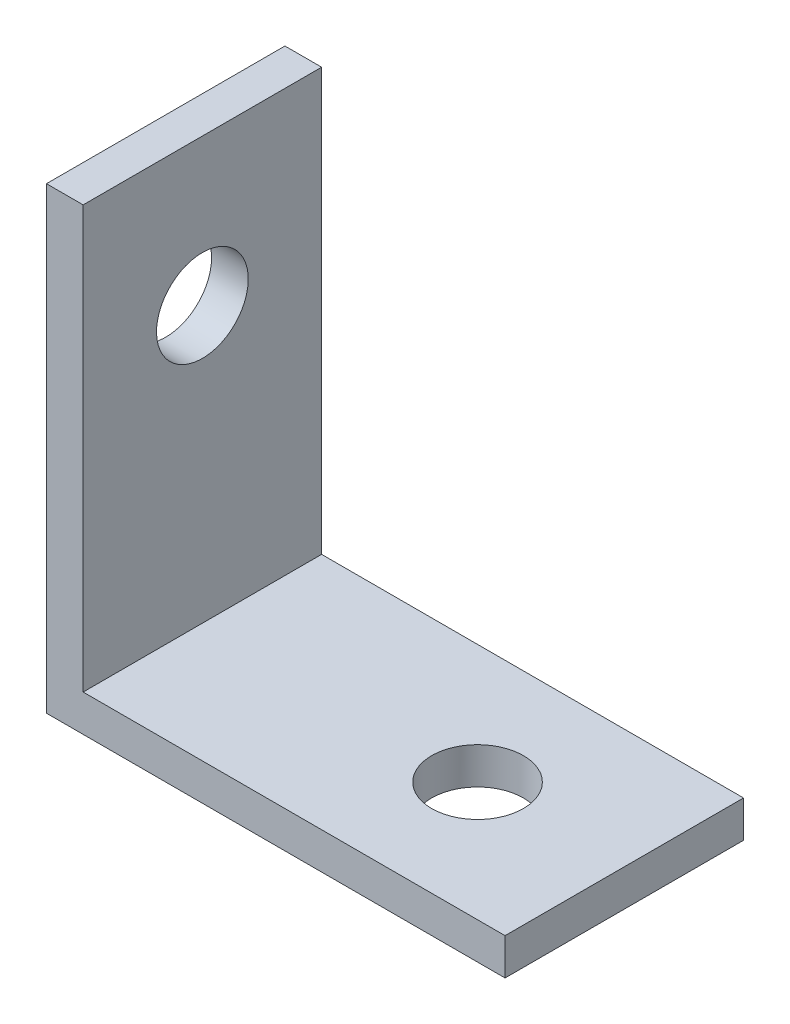
ISO-10303-21;
HEADER;
FILE_DESCRIPTION(('STEP AP214'),'2;1');
FILE_NAME('part.step','',(''),(''),'','','');
FILE_SCHEMA(('AUTOMOTIVE_DESIGN { 1 0 10303 214 1 1 1 1 }'));
ENDSEC;
DATA;
#1=APPLICATION_CONTEXT('core data for automotive mechanical design processes');
#2=APPLICATION_PROTOCOL_DEFINITION('international standard','automotive_design',2000,#1);
#3=PRODUCT_CONTEXT('',#1,'mechanical');
#4=PRODUCT('Part','Part','',(#3));
#5=PRODUCT_RELATED_PRODUCT_CATEGORY('part','',(#4));
#6=PRODUCT_DEFINITION_FORMATION('','',#4);
#7=PRODUCT_DEFINITION_CONTEXT('part definition',#1,'design');
#8=PRODUCT_DEFINITION('design','',#6,#7);
#9=PRODUCT_DEFINITION_SHAPE('','',#8);
#10=(LENGTH_UNIT() NAMED_UNIT(*) SI_UNIT(.MILLI.,.METRE.));
#11=(NAMED_UNIT(*) PLANE_ANGLE_UNIT() SI_UNIT($,.RADIAN.));
#12=(NAMED_UNIT(*) SI_UNIT($,.STERADIAN.) SOLID_ANGLE_UNIT());
#13=UNCERTAINTY_MEASURE_WITH_UNIT(LENGTH_MEASURE(1.E-05),#10,'distance_accuracy_value','');
#14=(GEOMETRIC_REPRESENTATION_CONTEXT(3) GLOBAL_UNCERTAINTY_ASSIGNED_CONTEXT((#13)) GLOBAL_UNIT_ASSIGNED_CONTEXT((#10,
#11,#12)) REPRESENTATION_CONTEXT('',''));
#15=CARTESIAN_POINT('',(0.,0.,0.));
#16=DIRECTION('',(0.,0.,1.));
#17=DIRECTION('',(1.,0.,0.));
#18=AXIS2_PLACEMENT_3D('',#15,#16,#17);
#19=CARTESIAN_POINT('',(-19.4893077067356,8.61198544614218,13.));
#20=DIRECTION('',(0.,-1.,0.));
#21=DIRECTION('',(0.,0.,-1.));
#22=AXIS2_PLACEMENT_3D('',#19,#20,#21);
#23=PLANE('',#22);
#24=CARTESIAN_POINT('',(-4.48930770673562,8.61198544614218,6.5));
#25=DIRECTION('',(0.,1.,0.));
#26=DIRECTION('',(0.,0.,1.));
#27=AXIS2_PLACEMENT_3D('',#24,#25,#26);
#28=CIRCLE('',#27,2.5);
#29=CARTESIAN_POINT('',(-4.48930770673562,8.61198544614218,9.));
#30=VERTEX_POINT('',#29);
#31=EDGE_CURVE('E144',#30,#30,#28,.T.);
#32=ORIENTED_EDGE('',*,*,#31,.F.);
#33=EDGE_LOOP('',(#32));
#34=FACE_BOUND('',#33,.T.);
#35=DIRECTION('',(-1.,0.,0.));
#36=VECTOR('',#35,1.);
#37=CARTESIAN_POINT('',(-19.4893077067356,8.61198544614218,0.));
#38=LINE('',#37,#36);
#39=CARTESIAN_POINT('',(3.51069229326438,8.61198544614218,0.));
#40=VERTEX_POINT('',#39);
#41=CARTESIAN_POINT('',(-19.4893077067356,8.61198544614218,0.));
#42=VERTEX_POINT('',#41);
#43=EDGE_CURVE('E119',#40,#42,#38,.T.);
#44=ORIENTED_EDGE('',*,*,#43,.T.);
#45=DIRECTION('',(0.,0.,-1.));
#46=VECTOR('',#45,1.);
#47=CARTESIAN_POINT('',(-19.4893077067356,8.61198544614218,13.));
#48=LINE('',#47,#46);
#49=CARTESIAN_POINT('',(-19.4893077067356,8.61198544614218,13.));
#50=VERTEX_POINT('',#49);
#51=EDGE_CURVE('E11',#50,#42,#48,.T.);
#52=ORIENTED_EDGE('',*,*,#51,.F.);
#53=DIRECTION('',(-1.,0.,0.));
#54=VECTOR('',#53,1.);
#55=CARTESIAN_POINT('',(-19.4893077067356,8.61198544614218,13.));
#56=LINE('',#55,#54);
#57=CARTESIAN_POINT('',(3.51069229326438,8.61198544614218,13.));
#58=VERTEX_POINT('',#57);
#59=EDGE_CURVE('E130',#58,#50,#56,.T.);
#60=ORIENTED_EDGE('',*,*,#59,.F.);
#61=DIRECTION('',(0.,0.,-1.));
#62=VECTOR('',#61,1.);
#63=CARTESIAN_POINT('',(3.51069229326438,8.61198544614218,13.));
#64=LINE('',#63,#62);
#65=EDGE_CURVE('E115',#58,#40,#64,.T.);
#66=ORIENTED_EDGE('',*,*,#65,.T.);
#67=EDGE_LOOP('',(#44,#52,#60,#66));
#68=FACE_BOUND('',#67,.T.);
#69=ADVANCED_FACE('F33',(#34,#68),#23,.F.);
#70=CARTESIAN_POINT('',(-19.4893077067356,31.6119854461422,13.));
#71=DIRECTION('',(-1.,0.,0.));
#72=DIRECTION('',(0.,-1.,0.));
#73=AXIS2_PLACEMENT_3D('',#70,#71,#72);
#74=PLANE('',#73);
#75=CARTESIAN_POINT('',(-19.4893077067356,23.6119854461422,6.5));
#76=DIRECTION('',(1.,0.,0.));
#77=DIRECTION('',(0.,1.,0.));
#78=AXIS2_PLACEMENT_3D('',#75,#76,#77);
#79=CIRCLE('',#78,2.5);
#80=CARTESIAN_POINT('',(-19.4893077067356,26.1119854461422,6.5));
#81=VERTEX_POINT('',#80);
#82=EDGE_CURVE('E136',#81,#81,#79,.T.);
#83=ORIENTED_EDGE('',*,*,#82,.F.);
#84=EDGE_LOOP('',(#83));
#85=FACE_BOUND('',#84,.T.);
#86=DIRECTION('',(0.,1.,0.));
#87=VECTOR('',#86,1.);
#88=CARTESIAN_POINT('',(-19.4893077067356,31.6119854461422,0.));
#89=LINE('',#88,#87);
#90=CARTESIAN_POINT('',(-19.4893077067356,31.6119854461422,0.));
#91=VERTEX_POINT('',#90);
#92=EDGE_CURVE('E122',#42,#91,#89,.T.);
#93=ORIENTED_EDGE('',*,*,#92,.T.);
#94=DIRECTION('',(0.,0.,-1.));
#95=VECTOR('',#94,1.);
#96=CARTESIAN_POINT('',(-19.4893077067356,31.6119854461422,13.));
#97=LINE('',#96,#95);
#98=CARTESIAN_POINT('',(-19.4893077067356,31.6119854461422,13.));
#99=VERTEX_POINT('',#98);
#100=EDGE_CURVE('E42',#99,#91,#97,.T.);
#101=ORIENTED_EDGE('',*,*,#100,.F.);
#102=DIRECTION('',(0.,1.,0.));
#103=VECTOR('',#102,1.);
#104=CARTESIAN_POINT('',(-19.4893077067356,31.6119854461422,13.));
#105=LINE('',#104,#103);
#106=EDGE_CURVE('E88',#50,#99,#105,.T.);
#107=ORIENTED_EDGE('',*,*,#106,.F.);
#108=ORIENTED_EDGE('',*,*,#51,.T.);
#109=EDGE_LOOP('',(#93,#101,#107,#108));
#110=FACE_BOUND('',#109,.T.);
#111=ADVANCED_FACE('F150',(#85,#110),#74,.F.);
#112=CARTESIAN_POINT('',(-21.4893077067356,31.6119854461422,13.));
#113=DIRECTION('',(0.,-1.,0.));
#114=DIRECTION('',(0.,0.,-1.));
#115=AXIS2_PLACEMENT_3D('',#112,#113,#114);
#116=PLANE('',#115);
#117=DIRECTION('',(-1.,0.,0.));
#118=VECTOR('',#117,1.);
#119=CARTESIAN_POINT('',(-21.4893077067356,31.6119854461422,0.));
#120=LINE('',#119,#118);
#121=CARTESIAN_POINT('',(-21.4893077067356,31.6119854461422,0.));
#122=VERTEX_POINT('',#121);
#123=EDGE_CURVE('E125',#91,#122,#120,.T.);
#124=ORIENTED_EDGE('',*,*,#123,.T.);
#125=DIRECTION('',(0.,0.,-1.));
#126=VECTOR('',#125,1.);
#127=CARTESIAN_POINT('',(-21.4893077067356,31.6119854461422,13.));
#128=LINE('',#127,#126);
#129=CARTESIAN_POINT('',(-21.4893077067356,31.6119854461422,13.));
#130=VERTEX_POINT('',#129);
#131=EDGE_CURVE('E110',#130,#122,#128,.T.);
#132=ORIENTED_EDGE('',*,*,#131,.F.);
#133=DIRECTION('',(-1.,0.,0.));
#134=VECTOR('',#133,1.);
#135=CARTESIAN_POINT('',(-21.4893077067356,31.6119854461422,13.));
#136=LINE('',#135,#134);
#137=EDGE_CURVE('E101',#99,#130,#136,.T.);
#138=ORIENTED_EDGE('',*,*,#137,.F.);
#139=ORIENTED_EDGE('',*,*,#100,.T.);
#140=EDGE_LOOP('',(#124,#132,#138,#139));
#141=FACE_BOUND('',#140,.T.);
#142=ADVANCED_FACE('F153',(#141),#116,.F.);
#143=CARTESIAN_POINT('',(-21.4893077067356,6.61198544614218,13.));
#144=DIRECTION('',(1.,0.,0.));
#145=DIRECTION('',(0.,0.,-1.));
#146=AXIS2_PLACEMENT_3D('',#143,#144,#145);
#147=PLANE('',#146);
#148=CARTESIAN_POINT('',(-21.4893077067356,23.6119854461422,6.5));
#149=DIRECTION('',(1.,0.,0.));
#150=DIRECTION('',(0.,0.,-1.));
#151=AXIS2_PLACEMENT_3D('',#148,#149,#150);
#152=CIRCLE('',#151,2.5);
#153=CARTESIAN_POINT('',(-21.4893077067356,23.6119854461422,4.));
#154=VERTEX_POINT('',#153);
#155=EDGE_CURVE('E123',#154,#154,#152,.T.);
#156=ORIENTED_EDGE('',*,*,#155,.T.);
#157=EDGE_LOOP('',(#156));
#158=FACE_BOUND('',#157,.T.);
#159=DIRECTION('',(0.,-1.,0.));
#160=VECTOR('',#159,1.);
#161=CARTESIAN_POINT('',(-21.4893077067356,6.61198544614218,0.));
#162=LINE('',#161,#160);
#163=CARTESIAN_POINT('',(-21.4893077067356,6.61198544614218,0.));
#164=VERTEX_POINT('',#163);
#165=EDGE_CURVE('E109',#122,#164,#162,.T.);
#166=ORIENTED_EDGE('',*,*,#165,.T.);
#167=DIRECTION('',(0.,0.,-1.));
#168=VECTOR('',#167,1.);
#169=CARTESIAN_POINT('',(-21.4893077067356,6.61198544614218,13.));
#170=LINE('',#169,#168);
#171=CARTESIAN_POINT('',(-21.4893077067356,6.61198544614218,13.));
#172=VERTEX_POINT('',#171);
#173=EDGE_CURVE('E106',#172,#164,#170,.T.);
#174=ORIENTED_EDGE('',*,*,#173,.F.);
#175=DIRECTION('',(0.,-1.,0.));
#176=VECTOR('',#175,1.);
#177=CARTESIAN_POINT('',(-21.4893077067356,6.61198544614218,13.));
#178=LINE('',#177,#176);
#179=EDGE_CURVE('E95',#130,#172,#178,.T.);
#180=ORIENTED_EDGE('',*,*,#179,.F.);
#181=ORIENTED_EDGE('',*,*,#131,.T.);
#182=EDGE_LOOP('',(#166,#174,#180,#181));
#183=FACE_BOUND('',#182,.T.);
#184=ADVANCED_FACE('F107',(#158,#183),#147,.F.);
#185=CARTESIAN_POINT('',(3.51069229326438,6.61198544614218,13.));
#186=DIRECTION('',(0.,1.,0.));
#187=DIRECTION('',(-1.,0.,0.));
#188=AXIS2_PLACEMENT_3D('',#185,#186,#187);
#189=PLANE('',#188);
#190=CARTESIAN_POINT('',(-4.48930770673562,6.61198544614218,6.5));
#191=DIRECTION('',(0.,1.,0.));
#192=DIRECTION('',(-1.,0.,0.));
#193=AXIS2_PLACEMENT_3D('',#190,#191,#192);
#194=CIRCLE('',#193,2.5);
#195=CARTESIAN_POINT('',(-6.98930770673562,6.61198544614218,6.5));
#196=VERTEX_POINT('',#195);
#197=EDGE_CURVE('E36',#196,#196,#194,.T.);
#198=ORIENTED_EDGE('',*,*,#197,.T.);
#199=EDGE_LOOP('',(#198));
#200=FACE_BOUND('',#199,.T.);
#201=DIRECTION('',(1.,0.,0.));
#202=VECTOR('',#201,1.);
#203=CARTESIAN_POINT('',(3.51069229326438,6.61198544614218,0.));
#204=LINE('',#203,#202);
#205=CARTESIAN_POINT('',(3.51069229326438,6.61198544614218,0.));
#206=VERTEX_POINT('',#205);
#207=EDGE_CURVE('E74',#164,#206,#204,.T.);
#208=ORIENTED_EDGE('',*,*,#207,.T.);
#209=DIRECTION('',(0.,0.,-1.));
#210=VECTOR('',#209,1.);
#211=CARTESIAN_POINT('',(3.51069229326438,6.61198544614218,13.));
#212=LINE('',#211,#210);
#213=CARTESIAN_POINT('',(3.51069229326438,6.61198544614218,13.));
#214=VERTEX_POINT('',#213);
#215=EDGE_CURVE('E111',#214,#206,#212,.T.);
#216=ORIENTED_EDGE('',*,*,#215,.F.);
#217=DIRECTION('',(1.,0.,0.));
#218=VECTOR('',#217,1.);
#219=CARTESIAN_POINT('',(3.51069229326438,6.61198544614218,13.));
#220=LINE('',#219,#218);
#221=EDGE_CURVE('E99',#172,#214,#220,.T.);
#222=ORIENTED_EDGE('',*,*,#221,.F.);
#223=ORIENTED_EDGE('',*,*,#173,.T.);
#224=EDGE_LOOP('',(#208,#216,#222,#223));
#225=FACE_BOUND('',#224,.T.);
#226=ADVANCED_FACE('F113',(#200,#225),#189,.F.);
#227=CARTESIAN_POINT('',(3.51069229326438,8.61198544614218,13.));
#228=DIRECTION('',(-1.,0.,0.));
#229=DIRECTION('',(0.,0.,1.));
#230=AXIS2_PLACEMENT_3D('',#227,#228,#229);
#231=PLANE('',#230);
#232=DIRECTION('',(0.,1.,0.));
#233=VECTOR('',#232,1.);
#234=CARTESIAN_POINT('',(3.51069229326438,8.61198544614218,0.));
#235=LINE('',#234,#233);
#236=EDGE_CURVE('E80',#206,#40,#235,.T.);
#237=ORIENTED_EDGE('',*,*,#236,.T.);
#238=ORIENTED_EDGE('',*,*,#65,.F.);
#239=DIRECTION('',(0.,1.,0.));
#240=VECTOR('',#239,1.);
#241=CARTESIAN_POINT('',(3.51069229326438,8.61198544614218,13.));
#242=LINE('',#241,#240);
#243=EDGE_CURVE('E51',#214,#58,#242,.T.);
#244=ORIENTED_EDGE('',*,*,#243,.F.);
#245=ORIENTED_EDGE('',*,*,#215,.T.);
#246=EDGE_LOOP('',(#237,#238,#244,#245));
#247=FACE_BOUND('',#246,.T.);
#248=ADVANCED_FACE('F158',(#247),#231,.F.);
#249=CARTESIAN_POINT('',(0.,0.,13.));
#250=DIRECTION('',(0.,0.,-1.));
#251=DIRECTION('',(-1.,0.,0.));
#252=AXIS2_PLACEMENT_3D('',#249,#250,#251);
#253=PLANE('',#252);
#254=ORIENTED_EDGE('',*,*,#59,.T.);
#255=ORIENTED_EDGE('',*,*,#106,.T.);
#256=ORIENTED_EDGE('',*,*,#137,.T.);
#257=ORIENTED_EDGE('',*,*,#179,.T.);
#258=ORIENTED_EDGE('',*,*,#221,.T.);
#259=ORIENTED_EDGE('',*,*,#243,.T.);
#260=EDGE_LOOP('',(#254,#255,#256,#257,#258,#259));
#261=FACE_BOUND('',#260,.T.);
#262=ADVANCED_FACE('F97',(#261),#253,.F.);
#263=CARTESIAN_POINT('',(0.,0.,0.));
#264=DIRECTION('',(0.,0.,-1.));
#265=DIRECTION('',(-1.,0.,0.));
#266=AXIS2_PLACEMENT_3D('',#263,#264,#265);
#267=PLANE('',#266);
#268=ORIENTED_EDGE('',*,*,#43,.F.);
#269=ORIENTED_EDGE('',*,*,#236,.F.);
#270=ORIENTED_EDGE('',*,*,#207,.F.);
#271=ORIENTED_EDGE('',*,*,#165,.F.);
#272=ORIENTED_EDGE('',*,*,#123,.F.);
#273=ORIENTED_EDGE('',*,*,#92,.F.);
#274=EDGE_LOOP('',(#268,#269,#270,#271,#272,#273));
#275=FACE_BOUND('',#274,.T.);
#276=ADVANCED_FACE('F156',(#275),#267,.T.);
#277=CARTESIAN_POINT('',(-27.4893077067356,23.6119854461422,6.5));
#278=DIRECTION('',(1.,0.,0.));
#279=DIRECTION('',(0.,1.,0.));
#280=AXIS2_PLACEMENT_3D('',#277,#278,#279);
#281=CYLINDRICAL_SURFACE('',#280,2.5);
#282=ORIENTED_EDGE('',*,*,#82,.T.);
#283=EDGE_LOOP('',(#282));
#284=FACE_BOUND('',#283,.T.);
#285=ORIENTED_EDGE('',*,*,#155,.F.);
#286=EDGE_LOOP('',(#285));
#287=FACE_BOUND('',#286,.T.);
#288=ADVANCED_FACE('F181',(#284,#287),#281,.F.);
#289=CARTESIAN_POINT('',(-4.48930770673562,0.611985446142181,6.5));
#290=DIRECTION('',(0.,1.,0.));
#291=DIRECTION('',(0.,0.,1.));
#292=AXIS2_PLACEMENT_3D('',#289,#290,#291);
#293=CYLINDRICAL_SURFACE('',#292,2.5);
#294=ORIENTED_EDGE('',*,*,#31,.T.);
#295=EDGE_LOOP('',(#294));
#296=FACE_BOUND('',#295,.T.);
#297=ORIENTED_EDGE('',*,*,#197,.F.);
#298=EDGE_LOOP('',(#297));
#299=FACE_BOUND('',#298,.T.);
#300=ADVANCED_FACE('F178',(#296,#299),#293,.F.);
#301=CLOSED_SHELL('',(#69,#111,#142,#184,#226,#248,#262,#276,#288,#300));
#302=MANIFOLD_SOLID_BREP('B2',#301);
#303=ADVANCED_BREP_SHAPE_REPRESENTATION('',(#18,#302),#14);
#304=SHAPE_DEFINITION_REPRESENTATION(#9,#303);
ENDSEC;
END-ISO-10303-21;
